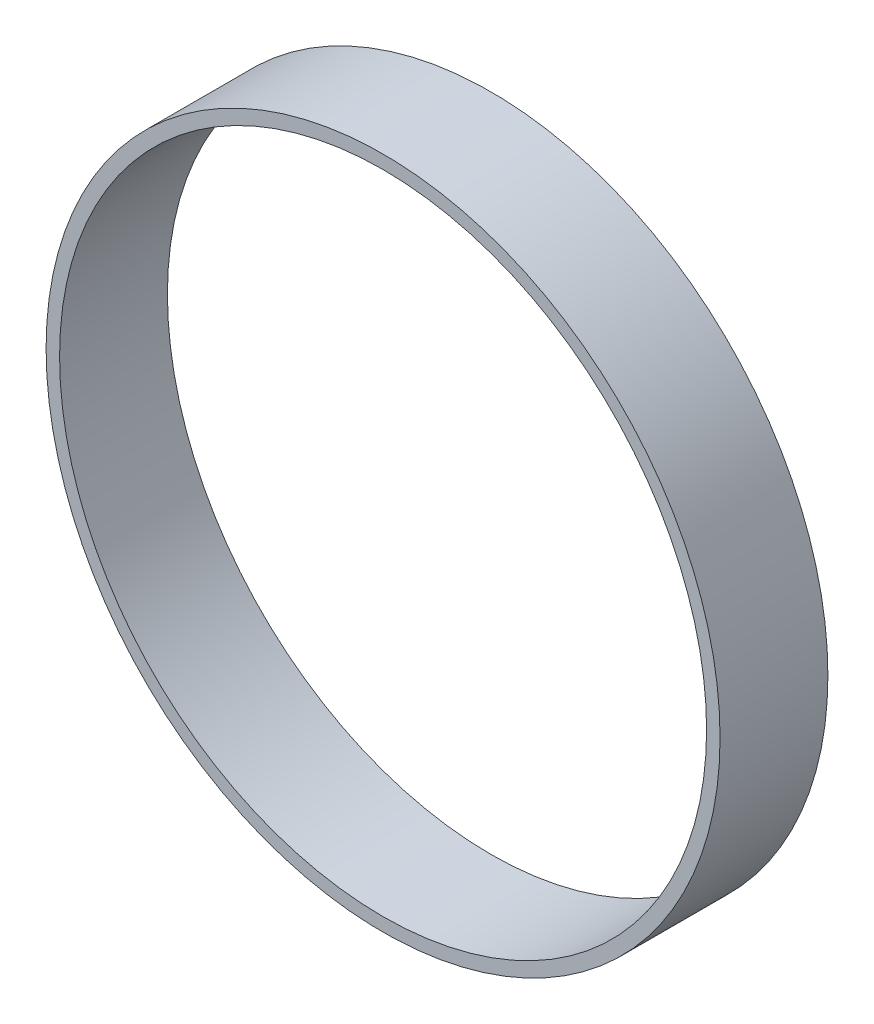
ISO-10303-21;
HEADER;
FILE_DESCRIPTION(('STEP AP214'),'2;1');
FILE_NAME('part.step','',(''),(''),'','','');
FILE_SCHEMA(('AUTOMOTIVE_DESIGN { 1 0 10303 214 1 1 1 1 }'));
ENDSEC;
DATA;
#1=APPLICATION_CONTEXT('core data for automotive mechanical design processes');
#2=APPLICATION_PROTOCOL_DEFINITION('international standard','automotive_design',2000,#1);
#3=PRODUCT_CONTEXT('',#1,'mechanical');
#4=PRODUCT('Part','Part','',(#3));
#5=PRODUCT_RELATED_PRODUCT_CATEGORY('part','',(#4));
#6=PRODUCT_DEFINITION_FORMATION('','',#4);
#7=PRODUCT_DEFINITION_CONTEXT('part definition',#1,'design');
#8=PRODUCT_DEFINITION('design','',#6,#7);
#9=PRODUCT_DEFINITION_SHAPE('','',#8);
#10=(LENGTH_UNIT() NAMED_UNIT(*) SI_UNIT(.MILLI.,.METRE.));
#11=(NAMED_UNIT(*) PLANE_ANGLE_UNIT() SI_UNIT($,.RADIAN.));
#12=(NAMED_UNIT(*) SI_UNIT($,.STERADIAN.) SOLID_ANGLE_UNIT());
#13=UNCERTAINTY_MEASURE_WITH_UNIT(LENGTH_MEASURE(1.E-05),#10,'distance_accuracy_value','');
#14=(GEOMETRIC_REPRESENTATION_CONTEXT(3) GLOBAL_UNCERTAINTY_ASSIGNED_CONTEXT((#13)) GLOBAL_UNIT_ASSIGNED_CONTEXT((#10,
#11,#12)) REPRESENTATION_CONTEXT('',''));
#15=CARTESIAN_POINT('',(0.,0.,0.));
#16=DIRECTION('',(0.,0.,1.));
#17=DIRECTION('',(1.,0.,0.));
#18=AXIS2_PLACEMENT_3D('',#15,#16,#17);
#19=CARTESIAN_POINT('',(0.,158.75,88.9));
#20=DIRECTION('',(0.,0.,1.));
#21=DIRECTION('',(1.,0.,0.));
#22=AXIS2_PLACEMENT_3D('',#19,#20,#21);
#23=PLANE('',#22);
#24=CARTESIAN_POINT('',(0.,0.,88.9));
#25=DIRECTION('',(0.,0.,-1.));
#26=DIRECTION('',(-1.,0.,0.));
#27=AXIS2_PLACEMENT_3D('',#24,#25,#26);
#28=CIRCLE('',#27,152.4);
#29=CARTESIAN_POINT('',(-152.4,0.,88.9));
#30=VERTEX_POINT('',#29);
#31=EDGE_CURVE('E10',#30,#30,#28,.T.);
#32=ORIENTED_EDGE('',*,*,#31,.T.);
#33=EDGE_LOOP('',(#32));
#34=FACE_BOUND('',#33,.T.);
#35=CARTESIAN_POINT('',(0.,0.,88.9));
#36=DIRECTION('',(0.,0.,-1.));
#37=DIRECTION('',(-1.,0.,0.));
#38=AXIS2_PLACEMENT_3D('',#35,#36,#37);
#39=CIRCLE('',#38,158.75);
#40=CARTESIAN_POINT('',(-158.75,0.,88.9));
#41=VERTEX_POINT('',#40);
#42=EDGE_CURVE('E44',#41,#41,#39,.T.);
#43=ORIENTED_EDGE('',*,*,#42,.F.);
#44=EDGE_LOOP('',(#43));
#45=FACE_BOUND('',#44,.T.);
#46=ADVANCED_FACE('F30',(#34,#45),#23,.T.);
#47=CARTESIAN_POINT('',(0.,0.,12.5905172413793));
#48=DIRECTION('',(0.,0.,-1.));
#49=DIRECTION('',(-1.,0.,0.));
#50=AXIS2_PLACEMENT_3D('',#47,#48,#49);
#51=CYLINDRICAL_SURFACE('',#50,152.4);
#52=CARTESIAN_POINT('',(0.,0.,38.1));
#53=DIRECTION('',(0.,0.,-1.));
#54=DIRECTION('',(-1.,0.,0.));
#55=AXIS2_PLACEMENT_3D('',#52,#53,#54);
#56=CIRCLE('',#55,152.4);
#57=CARTESIAN_POINT('',(-152.4,0.,38.1));
#58=VERTEX_POINT('',#57);
#59=EDGE_CURVE('E36',#58,#58,#56,.T.);
#60=ORIENTED_EDGE('',*,*,#59,.T.);
#61=EDGE_LOOP('',(#60));
#62=FACE_BOUND('',#61,.T.);
#63=ORIENTED_EDGE('',*,*,#31,.F.);
#64=EDGE_LOOP('',(#63));
#65=FACE_BOUND('',#64,.T.);
#66=ADVANCED_FACE('F54',(#62,#65),#51,.F.);
#67=CARTESIAN_POINT('',(0.,158.75,38.1));
#68=DIRECTION('',(0.,0.,-1.));
#69=DIRECTION('',(-1.,0.,0.));
#70=AXIS2_PLACEMENT_3D('',#67,#68,#69);
#71=PLANE('',#70);
#72=CARTESIAN_POINT('',(0.,0.,38.1));
#73=DIRECTION('',(0.,0.,-1.));
#74=DIRECTION('',(-1.,0.,0.));
#75=AXIS2_PLACEMENT_3D('',#72,#73,#74);
#76=CIRCLE('',#75,158.75);
#77=CARTESIAN_POINT('',(-158.75,0.,38.1));
#78=VERTEX_POINT('',#77);
#79=EDGE_CURVE('E40',#78,#78,#76,.T.);
#80=ORIENTED_EDGE('',*,*,#79,.T.);
#81=EDGE_LOOP('',(#80));
#82=FACE_BOUND('',#81,.T.);
#83=ORIENTED_EDGE('',*,*,#59,.F.);
#84=EDGE_LOOP('',(#83));
#85=FACE_BOUND('',#84,.T.);
#86=ADVANCED_FACE('F58',(#82,#85),#71,.T.);
#87=CARTESIAN_POINT('',(0.,0.,12.5905172413793));
#88=DIRECTION('',(0.,0.,-1.));
#89=DIRECTION('',(-1.,0.,0.));
#90=AXIS2_PLACEMENT_3D('',#87,#88,#89);
#91=CYLINDRICAL_SURFACE('',#90,158.75);
#92=ORIENTED_EDGE('',*,*,#42,.T.);
#93=EDGE_LOOP('',(#92));
#94=FACE_BOUND('',#93,.T.);
#95=ORIENTED_EDGE('',*,*,#79,.F.);
#96=EDGE_LOOP('',(#95));
#97=FACE_BOUND('',#96,.T.);
#98=ADVANCED_FACE('F50',(#94,#97),#91,.T.);
#99=CLOSED_SHELL('',(#46,#66,#86,#98));
#100=MANIFOLD_SOLID_BREP('B2',#99);
#101=ADVANCED_BREP_SHAPE_REPRESENTATION('',(#18,#100),#14);
#102=SHAPE_DEFINITION_REPRESENTATION(#9,#101);
ENDSEC;
END-ISO-10303-21;
